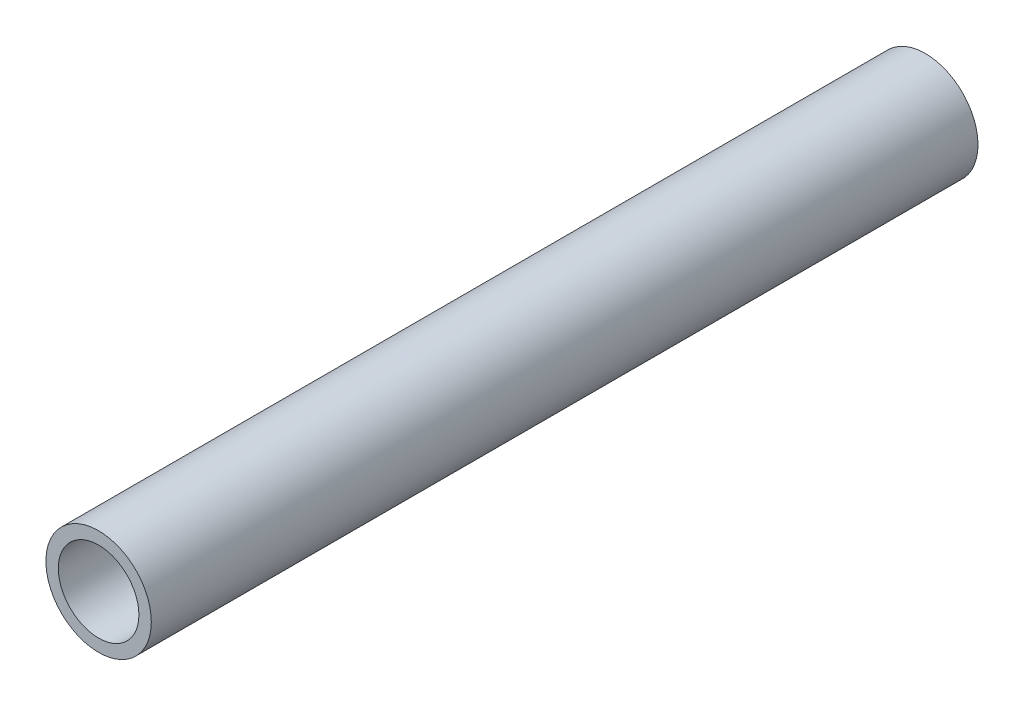
ISO-10303-21;
HEADER;
FILE_DESCRIPTION(('STEP AP214'),'2;1');
FILE_NAME('part.step','',(''),(''),'','','');
FILE_SCHEMA(('AUTOMOTIVE_DESIGN { 1 0 10303 214 1 1 1 1 }'));
ENDSEC;
DATA;
#1=APPLICATION_CONTEXT('core data for automotive mechanical design processes');
#2=APPLICATION_PROTOCOL_DEFINITION('international standard','automotive_design',2000,#1);
#3=PRODUCT_CONTEXT('',#1,'mechanical');
#4=PRODUCT('Part','Part','',(#3));
#5=PRODUCT_RELATED_PRODUCT_CATEGORY('part','',(#4));
#6=PRODUCT_DEFINITION_FORMATION('','',#4);
#7=PRODUCT_DEFINITION_CONTEXT('part definition',#1,'design');
#8=PRODUCT_DEFINITION('design','',#6,#7);
#9=PRODUCT_DEFINITION_SHAPE('','',#8);
#10=(LENGTH_UNIT() NAMED_UNIT(*) SI_UNIT(.MILLI.,.METRE.));
#11=(NAMED_UNIT(*) PLANE_ANGLE_UNIT() SI_UNIT($,.RADIAN.));
#12=(NAMED_UNIT(*) SI_UNIT($,.STERADIAN.) SOLID_ANGLE_UNIT());
#13=UNCERTAINTY_MEASURE_WITH_UNIT(LENGTH_MEASURE(1.E-05),#10,'distance_accuracy_value','');
#14=(GEOMETRIC_REPRESENTATION_CONTEXT(3) GLOBAL_UNCERTAINTY_ASSIGNED_CONTEXT((#13)) GLOBAL_UNIT_ASSIGNED_CONTEXT((#10,
#11,#12)) REPRESENTATION_CONTEXT('',''));
#15=CARTESIAN_POINT('',(0.,0.,0.));
#16=DIRECTION('',(0.,0.,1.));
#17=DIRECTION('',(1.,0.,0.));
#18=AXIS2_PLACEMENT_3D('',#15,#16,#17);
#19=CARTESIAN_POINT('',(0.,0.,10.16));
#20=DIRECTION('',(0.,0.,1.));
#21=DIRECTION('',(1.,0.,0.));
#22=AXIS2_PLACEMENT_3D('',#19,#20,#21);
#23=PLANE('',#22);
#24=CARTESIAN_POINT('',(0.,0.,10.16));
#25=DIRECTION('',(0.,0.,1.));
#26=DIRECTION('',(1.,0.,0.));
#27=AXIS2_PLACEMENT_3D('',#24,#25,#26);
#28=CIRCLE('',#27,0.6477);
#29=CARTESIAN_POINT('',(0.6477,0.,10.16));
#30=VERTEX_POINT('',#29);
#31=EDGE_CURVE('E10',#30,#30,#28,.T.);
#32=ORIENTED_EDGE('',*,*,#31,.T.);
#33=EDGE_LOOP('',(#32));
#34=FACE_BOUND('',#33,.T.);
#35=CARTESIAN_POINT('',(0.,0.,10.16));
#36=DIRECTION('',(0.,0.,1.));
#37=DIRECTION('',(1.,0.,0.));
#38=AXIS2_PLACEMENT_3D('',#35,#36,#37);
#39=CIRCLE('',#38,0.4953);
#40=CARTESIAN_POINT('',(0.4953,0.,10.16));
#41=VERTEX_POINT('',#40);
#42=EDGE_CURVE('E45',#41,#41,#39,.T.);
#43=ORIENTED_EDGE('',*,*,#42,.F.);
#44=EDGE_LOOP('',(#43));
#45=FACE_BOUND('',#44,.T.);
#46=ADVANCED_FACE('F34',(#34,#45),#23,.T.);
#47=CARTESIAN_POINT('',(0.,0.,0.));
#48=DIRECTION('',(0.,0.,1.));
#49=DIRECTION('',(1.,0.,0.));
#50=AXIS2_PLACEMENT_3D('',#47,#48,#49);
#51=PLANE('',#50);
#52=CARTESIAN_POINT('',(0.,0.,0.));
#53=DIRECTION('',(0.,0.,1.));
#54=DIRECTION('',(1.,0.,0.));
#55=AXIS2_PLACEMENT_3D('',#52,#53,#54);
#56=CIRCLE('',#55,0.6477);
#57=CARTESIAN_POINT('',(0.6477,0.,0.));
#58=VERTEX_POINT('',#57);
#59=EDGE_CURVE('E38',#58,#58,#56,.T.);
#60=ORIENTED_EDGE('',*,*,#59,.F.);
#61=EDGE_LOOP('',(#60));
#62=FACE_BOUND('',#61,.T.);
#63=CARTESIAN_POINT('',(0.,0.,0.));
#64=DIRECTION('',(0.,0.,1.));
#65=DIRECTION('',(1.,0.,0.));
#66=AXIS2_PLACEMENT_3D('',#63,#64,#65);
#67=CIRCLE('',#66,0.4953);
#68=CARTESIAN_POINT('',(0.4953,0.,0.));
#69=VERTEX_POINT('',#68);
#70=EDGE_CURVE('E47',#69,#69,#67,.T.);
#71=ORIENTED_EDGE('',*,*,#70,.T.);
#72=EDGE_LOOP('',(#71));
#73=FACE_BOUND('',#72,.T.);
#74=ADVANCED_FACE('F57',(#62,#73),#51,.F.);
#75=CARTESIAN_POINT('',(0.,0.,10.16));
#76=DIRECTION('',(0.,0.,-1.));
#77=DIRECTION('',(-1.,0.,0.));
#78=AXIS2_PLACEMENT_3D('',#75,#76,#77);
#79=CYLINDRICAL_SURFACE('',#78,0.6477);
#80=ORIENTED_EDGE('',*,*,#31,.F.);
#81=EDGE_LOOP('',(#80));
#82=FACE_BOUND('',#81,.T.);
#83=ORIENTED_EDGE('',*,*,#59,.T.);
#84=EDGE_LOOP('',(#83));
#85=FACE_BOUND('',#84,.T.);
#86=ADVANCED_FACE('F36',(#82,#85),#79,.T.);
#87=CARTESIAN_POINT('',(0.,0.,10.16));
#88=DIRECTION('',(0.,0.,-1.));
#89=DIRECTION('',(-1.,0.,0.));
#90=AXIS2_PLACEMENT_3D('',#87,#88,#89);
#91=CYLINDRICAL_SURFACE('',#90,0.4953);
#92=ORIENTED_EDGE('',*,*,#42,.T.);
#93=EDGE_LOOP('',(#92));
#94=FACE_BOUND('',#93,.T.);
#95=ORIENTED_EDGE('',*,*,#70,.F.);
#96=EDGE_LOOP('',(#95));
#97=FACE_BOUND('',#96,.T.);
#98=ADVANCED_FACE('F53',(#94,#97),#91,.F.);
#99=CLOSED_SHELL('',(#46,#74,#86,#98));
#100=MANIFOLD_SOLID_BREP('B2',#99);
#101=ADVANCED_BREP_SHAPE_REPRESENTATION('',(#18,#100),#14);
#102=SHAPE_DEFINITION_REPRESENTATION(#9,#101);
ENDSEC;
END-ISO-10303-21;
